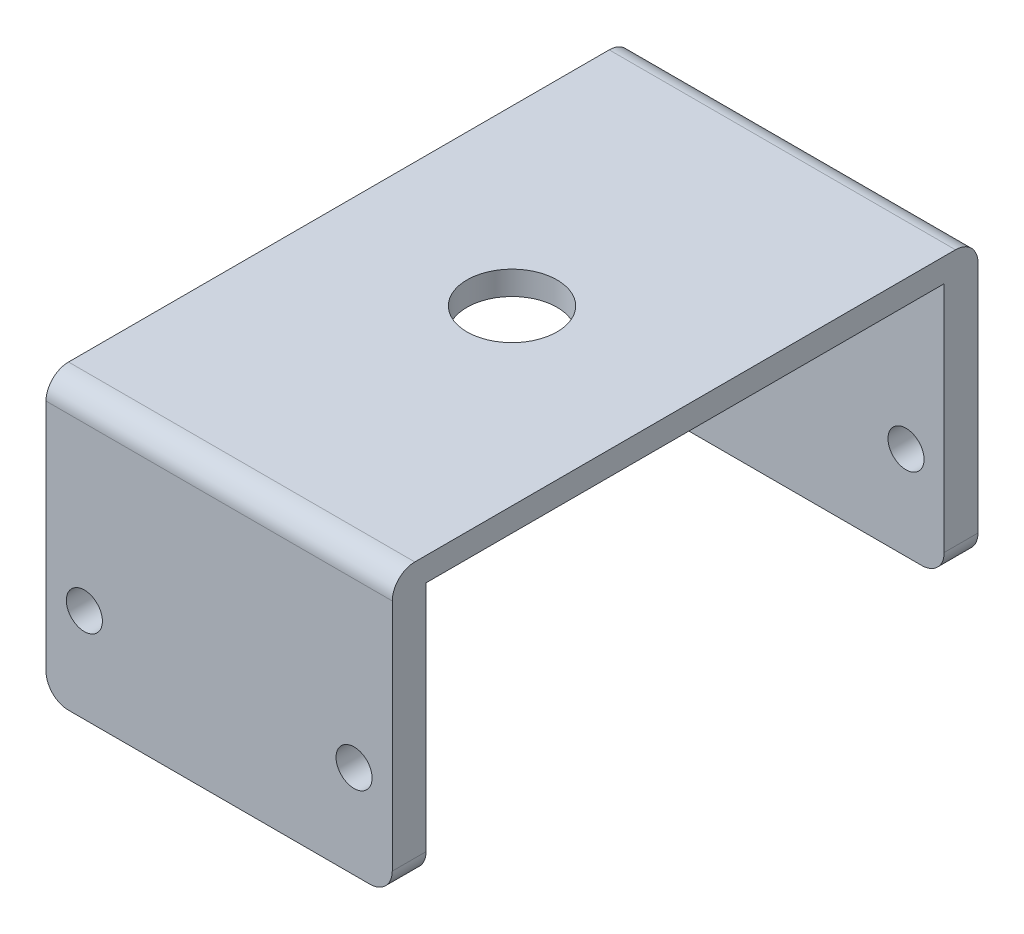
ISO-10303-21;
HEADER;
FILE_DESCRIPTION(('STEP AP214'),'2;1');
FILE_NAME('part.step','',(''),(''),'','','');
FILE_SCHEMA(('AUTOMOTIVE_DESIGN { 1 0 10303 214 1 1 1 1 }'));
ENDSEC;
DATA;
#1=APPLICATION_CONTEXT('core data for automotive mechanical design processes');
#2=APPLICATION_PROTOCOL_DEFINITION('international standard','automotive_design',2000,#1);
#3=PRODUCT_CONTEXT('',#1,'mechanical');
#4=PRODUCT('Part','Part','',(#3));
#5=PRODUCT_RELATED_PRODUCT_CATEGORY('part','',(#4));
#6=PRODUCT_DEFINITION_FORMATION('','',#4);
#7=PRODUCT_DEFINITION_CONTEXT('part definition',#1,'design');
#8=PRODUCT_DEFINITION('design','',#6,#7);
#9=PRODUCT_DEFINITION_SHAPE('','',#8);
#10=(LENGTH_UNIT() NAMED_UNIT(*) SI_UNIT(.MILLI.,.METRE.));
#11=(NAMED_UNIT(*) PLANE_ANGLE_UNIT() SI_UNIT($,.RADIAN.));
#12=(NAMED_UNIT(*) SI_UNIT($,.STERADIAN.) SOLID_ANGLE_UNIT());
#13=UNCERTAINTY_MEASURE_WITH_UNIT(LENGTH_MEASURE(1.E-05),#10,'distance_accuracy_value','');
#14=(GEOMETRIC_REPRESENTATION_CONTEXT(3) GLOBAL_UNCERTAINTY_ASSIGNED_CONTEXT((#13)) GLOBAL_UNIT_ASSIGNED_CONTEXT((#10,
#11,#12)) REPRESENTATION_CONTEXT('',''));
#15=CARTESIAN_POINT('',(0.,0.,0.));
#16=DIRECTION('',(0.,0.,1.));
#17=DIRECTION('',(1.,0.,0.));
#18=AXIS2_PLACEMENT_3D('',#15,#16,#17);
#19=CARTESIAN_POINT('',(28.6490619392168,74.1207320545637,-2.));
#20=DIRECTION('',(-1.,0.,0.));
#21=DIRECTION('',(0.,0.,1.));
#22=AXIS2_PLACEMENT_3D('',#19,#20,#21);
#23=PLANE('',#22);
#24=DIRECTION('',(0.,-1.,0.));
#25=VECTOR('',#24,1.);
#26=CARTESIAN_POINT('',(28.6490619392168,74.1207320545637,47.));
#27=LINE('',#26,#25);
#28=CARTESIAN_POINT('',(28.6490619392168,72.0132027112234,47.));
#29=VERTEX_POINT('',#28);
#30=CARTESIAN_POINT('',(28.6490619392168,51.3468369760944,47.));
#31=VERTEX_POINT('',#30);
#32=EDGE_CURVE('E187',#29,#31,#27,.T.);
#33=ORIENTED_EDGE('',*,*,#32,.T.);
#34=DIRECTION('',(0.,0.,1.));
#35=VECTOR('',#34,1.);
#36=CARTESIAN_POINT('',(28.6490619392168,51.3468369760944,-2.));
#37=LINE('',#36,#35);
#38=CARTESIAN_POINT('',(28.6490619392168,51.3468369760944,50.));
#39=VERTEX_POINT('',#38);
#40=EDGE_CURVE('E240',#31,#39,#37,.T.);
#41=ORIENTED_EDGE('',*,*,#40,.T.);
#42=DIRECTION('',(0.,-1.,0.));
#43=VECTOR('',#42,1.);
#44=CARTESIAN_POINT('',(28.6490619392168,74.1207320545637,50.));
#45=LINE('',#44,#43);
#46=CARTESIAN_POINT('',(28.6490619392168,72.1207320545637,50.));
#47=VERTEX_POINT('',#46);
#48=EDGE_CURVE('E197',#47,#39,#45,.T.);
#49=ORIENTED_EDGE('',*,*,#48,.F.);
#50=CARTESIAN_POINT('',(28.6490619392168,72.1207320545637,48.));
#51=DIRECTION('',(-1.,0.,0.));
#52=DIRECTION('',(0.,0.,1.));
#53=AXIS2_PLACEMENT_3D('',#50,#51,#52);
#54=CIRCLE('',#53,2.);
#55=CARTESIAN_POINT('',(28.6490619392168,74.1207320545637,48.));
#56=VERTEX_POINT('',#55);
#57=EDGE_CURVE('E235',#47,#56,#54,.T.);
#58=ORIENTED_EDGE('',*,*,#57,.T.);
#59=DIRECTION('',(0.,0.,1.));
#60=VECTOR('',#59,1.);
#61=CARTESIAN_POINT('',(28.6490619392168,74.1207320545637,-2.));
#62=LINE('',#61,#60);
#63=CARTESIAN_POINT('',(28.6490619392168,74.1207320545637,0.));
#64=VERTEX_POINT('',#63);
#65=EDGE_CURVE('E221',#64,#56,#62,.T.);
#66=ORIENTED_EDGE('',*,*,#65,.F.);
#67=CARTESIAN_POINT('',(28.6490619392168,72.1207320545637,0.));
#68=DIRECTION('',(-1.,0.,0.));
#69=DIRECTION('',(0.,0.,1.));
#70=AXIS2_PLACEMENT_3D('',#67,#68,#69);
#71=CIRCLE('',#70,2.);
#72=CARTESIAN_POINT('',(28.6490619392168,72.1207320545637,-2.));
#73=VERTEX_POINT('',#72);
#74=EDGE_CURVE('E224',#64,#73,#71,.T.);
#75=ORIENTED_EDGE('',*,*,#74,.T.);
#76=DIRECTION('',(0.,-1.,0.));
#77=VECTOR('',#76,1.);
#78=CARTESIAN_POINT('',(28.6490619392168,74.1207320545637,-2.));
#79=LINE('',#78,#77);
#80=CARTESIAN_POINT('',(28.6490619392168,51.3468369760944,-2.));
#81=VERTEX_POINT('',#80);
#82=EDGE_CURVE('E212',#73,#81,#79,.T.);
#83=ORIENTED_EDGE('',*,*,#82,.T.);
#84=DIRECTION('',(0.,0.,1.));
#85=VECTOR('',#84,1.);
#86=CARTESIAN_POINT('',(28.6490619392168,51.3468369760944,-2.));
#87=LINE('',#86,#85);
#88=CARTESIAN_POINT('',(28.6490619392168,51.3468369760944,1.));
#89=VERTEX_POINT('',#88);
#90=EDGE_CURVE('E237',#81,#89,#87,.T.);
#91=ORIENTED_EDGE('',*,*,#90,.T.);
#92=DIRECTION('',(0.,-1.,0.));
#93=VECTOR('',#92,1.);
#94=CARTESIAN_POINT('',(28.6490619392168,74.1207320545637,1.));
#95=LINE('',#94,#93);
#96=CARTESIAN_POINT('',(28.6490619392168,72.0132027112234,1.));
#97=VERTEX_POINT('',#96);
#98=EDGE_CURVE('E181',#97,#89,#95,.T.);
#99=ORIENTED_EDGE('',*,*,#98,.F.);
#100=DIRECTION('',(0.,0.,-1.));
#101=VECTOR('',#100,1.);
#102=CARTESIAN_POINT('',(28.6490619392168,72.0132027112234,-2.));
#103=LINE('',#102,#101);
#104=EDGE_CURVE('E159',#29,#97,#103,.T.);
#105=ORIENTED_EDGE('',*,*,#104,.F.);
#106=EDGE_LOOP('',(#33,#41,#49,#58,#66,#75,#83,#91,#99,#105));
#107=FACE_BOUND('',#106,.T.);
#108=ADVANCED_FACE('F37',(#107),#23,.T.);
#109=CARTESIAN_POINT('',(59.3900912143275,74.1207320545637,-2.));
#110=DIRECTION('',(1.,0.,0.));
#111=DIRECTION('',(0.,0.,-1.));
#112=AXIS2_PLACEMENT_3D('',#109,#110,#111);
#113=PLANE('',#112);
#114=DIRECTION('',(0.,1.,0.));
#115=VECTOR('',#114,1.);
#116=CARTESIAN_POINT('',(59.3900912143275,74.1207320545637,50.));
#117=LINE('',#116,#115);
#118=CARTESIAN_POINT('',(59.3900912143275,51.3468369760944,50.));
#119=VERTEX_POINT('',#118);
#120=CARTESIAN_POINT('',(59.3900912143275,72.1207320545637,50.));
#121=VERTEX_POINT('',#120);
#122=EDGE_CURVE('E203',#119,#121,#117,.T.);
#123=ORIENTED_EDGE('',*,*,#122,.F.);
#124=DIRECTION('',(0.,0.,1.));
#125=VECTOR('',#124,1.);
#126=CARTESIAN_POINT('',(59.3900912143275,51.3468369760944,-2.));
#127=LINE('',#126,#125);
#128=CARTESIAN_POINT('',(59.3900912143275,51.3468369760944,47.));
#129=VERTEX_POINT('',#128);
#130=EDGE_CURVE('E265',#119,#129,#127,.F.);
#131=ORIENTED_EDGE('',*,*,#130,.T.);
#132=DIRECTION('',(0.,1.,0.));
#133=VECTOR('',#132,1.);
#134=CARTESIAN_POINT('',(59.3900912143275,0.,47.));
#135=LINE('',#134,#133);
#136=CARTESIAN_POINT('',(59.3900912143275,72.0132027112234,47.));
#137=VERTEX_POINT('',#136);
#138=EDGE_CURVE('E166',#129,#137,#135,.T.);
#139=ORIENTED_EDGE('',*,*,#138,.T.);
#140=DIRECTION('',(0.,0.,1.));
#141=VECTOR('',#140,1.);
#142=CARTESIAN_POINT('',(59.3900912143275,72.0132027112234,0.));
#143=LINE('',#142,#141);
#144=CARTESIAN_POINT('',(59.3900912143275,72.0132027112234,1.));
#145=VERTEX_POINT('',#144);
#146=EDGE_CURVE('E151',#145,#137,#143,.T.);
#147=ORIENTED_EDGE('',*,*,#146,.F.);
#148=DIRECTION('',(0.,1.,0.));
#149=VECTOR('',#148,1.);
#150=CARTESIAN_POINT('',(59.3900912143275,0.,1.));
#151=LINE('',#150,#149);
#152=CARTESIAN_POINT('',(59.3900912143275,51.3468369760944,1.));
#153=VERTEX_POINT('',#152);
#154=EDGE_CURVE('E139',#153,#145,#151,.T.);
#155=ORIENTED_EDGE('',*,*,#154,.F.);
#156=DIRECTION('',(0.,0.,1.));
#157=VECTOR('',#156,1.);
#158=CARTESIAN_POINT('',(59.3900912143275,51.3468369760944,-2.));
#159=LINE('',#158,#157);
#160=CARTESIAN_POINT('',(59.3900912143275,51.3468369760944,-2.));
#161=VERTEX_POINT('',#160);
#162=EDGE_CURVE('E263',#153,#161,#159,.F.);
#163=ORIENTED_EDGE('',*,*,#162,.T.);
#164=DIRECTION('',(0.,1.,0.));
#165=VECTOR('',#164,1.);
#166=CARTESIAN_POINT('',(59.3900912143275,74.1207320545637,-2.));
#167=LINE('',#166,#165);
#168=CARTESIAN_POINT('',(59.3900912143275,72.1207320545637,-2.));
#169=VERTEX_POINT('',#168);
#170=EDGE_CURVE('E217',#161,#169,#167,.T.);
#171=ORIENTED_EDGE('',*,*,#170,.T.);
#172=CARTESIAN_POINT('',(59.3900912143275,72.1207320545637,0.));
#173=DIRECTION('',(1.,0.,0.));
#174=DIRECTION('',(0.,0.,-1.));
#175=AXIS2_PLACEMENT_3D('',#172,#173,#174);
#176=CIRCLE('',#175,2.);
#177=CARTESIAN_POINT('',(59.3900912143275,74.1207320545637,0.));
#178=VERTEX_POINT('',#177);
#179=EDGE_CURVE('E259',#169,#178,#176,.T.);
#180=ORIENTED_EDGE('',*,*,#179,.T.);
#181=DIRECTION('',(0.,0.,1.));
#182=VECTOR('',#181,1.);
#183=CARTESIAN_POINT('',(59.3900912143275,74.1207320545637,-2.));
#184=LINE('',#183,#182);
#185=CARTESIAN_POINT('',(59.3900912143275,74.1207320545637,48.));
#186=VERTEX_POINT('',#185);
#187=EDGE_CURVE('E220',#178,#186,#184,.T.);
#188=ORIENTED_EDGE('',*,*,#187,.T.);
#189=CARTESIAN_POINT('',(59.3900912143275,72.1207320545637,48.));
#190=DIRECTION('',(1.,0.,0.));
#191=DIRECTION('',(0.,0.,-1.));
#192=AXIS2_PLACEMENT_3D('',#189,#190,#191);
#193=CIRCLE('',#192,2.);
#194=EDGE_CURVE('E261',#186,#121,#193,.T.);
#195=ORIENTED_EDGE('',*,*,#194,.T.);
#196=EDGE_LOOP('',(#123,#131,#139,#147,#155,#163,#171,#180,#188,#195));
#197=FACE_BOUND('',#196,.T.);
#198=ADVANCED_FACE('F164',(#197),#113,.T.);
#199=CARTESIAN_POINT('',(28.6490619392168,49.3468369760944,-2.));
#200=DIRECTION('',(0.,-1.,0.));
#201=DIRECTION('',(0.,0.,-1.));
#202=AXIS2_PLACEMENT_3D('',#199,#200,#201);
#203=PLANE('',#202);
#204=DIRECTION('',(1.,0.,0.));
#205=VECTOR('',#204,1.);
#206=CARTESIAN_POINT('',(28.6490619392168,49.3468369760944,50.));
#207=LINE('',#206,#205);
#208=CARTESIAN_POINT('',(30.6490619392168,49.3468369760944,50.));
#209=VERTEX_POINT('',#208);
#210=CARTESIAN_POINT('',(57.3900912143275,49.3468369760944,50.));
#211=VERTEX_POINT('',#210);
#212=EDGE_CURVE('E200',#209,#211,#207,.T.);
#213=ORIENTED_EDGE('',*,*,#212,.F.);
#214=DIRECTION('',(0.,0.,1.));
#215=VECTOR('',#214,1.);
#216=CARTESIAN_POINT('',(30.6490619392168,49.3468369760944,-2.));
#217=LINE('',#216,#215);
#218=CARTESIAN_POINT('',(30.6490619392168,49.3468369760944,47.));
#219=VERTEX_POINT('',#218);
#220=EDGE_CURVE('E253',#209,#219,#217,.F.);
#221=ORIENTED_EDGE('',*,*,#220,.T.);
#222=DIRECTION('',(1.,0.,0.));
#223=VECTOR('',#222,1.);
#224=CARTESIAN_POINT('',(9.3900912143275,49.3468369760944,47.));
#225=LINE('',#224,#223);
#226=CARTESIAN_POINT('',(57.3900912143275,49.3468369760944,47.));
#227=VERTEX_POINT('',#226);
#228=EDGE_CURVE('E172',#219,#227,#225,.T.);
#229=ORIENTED_EDGE('',*,*,#228,.T.);
#230=DIRECTION('',(0.,0.,1.));
#231=VECTOR('',#230,1.);
#232=CARTESIAN_POINT('',(57.3900912143275,49.3468369760944,-2.));
#233=LINE('',#232,#231);
#234=EDGE_CURVE('E250',#227,#211,#233,.T.);
#235=ORIENTED_EDGE('',*,*,#234,.T.);
#236=EDGE_LOOP('',(#213,#221,#229,#235));
#237=FACE_BOUND('',#236,.T.);
#238=ADVANCED_FACE('F309',(#237),#203,.T.);
#239=CARTESIAN_POINT('',(55.9991217398444,57.6069527072445,76.));
#240=DIRECTION('',(0.,0.,-1.));
#241=DIRECTION('',(-1.,0.,0.));
#242=AXIS2_PLACEMENT_3D('',#239,#240,#241);
#243=CYLINDRICAL_SURFACE('',#242,1.59999999999986);
#244=CARTESIAN_POINT('',(55.9991217398444,57.6069527072445,50.));
#245=DIRECTION('',(0.,0.,1.));
#246=DIRECTION('',(1.,0.,0.));
#247=AXIS2_PLACEMENT_3D('',#244,#245,#246);
#248=CIRCLE('',#247,1.59999999999986);
#249=CARTESIAN_POINT('',(57.5991217398443,57.6069527072445,50.));
#250=VERTEX_POINT('',#249);
#251=EDGE_CURVE('E191',#250,#250,#248,.T.);
#252=ORIENTED_EDGE('',*,*,#251,.T.);
#253=EDGE_LOOP('',(#252));
#254=FACE_BOUND('',#253,.T.);
#255=CARTESIAN_POINT('',(55.9991217398444,57.6069527072445,47.));
#256=DIRECTION('',(0.,0.,-1.));
#257=DIRECTION('',(-1.,0.,0.));
#258=AXIS2_PLACEMENT_3D('',#255,#256,#257);
#259=CIRCLE('',#258,1.59999999999986);
#260=CARTESIAN_POINT('',(54.3991217398445,57.6069527072445,47.));
#261=VERTEX_POINT('',#260);
#262=EDGE_CURVE('E184',#261,#261,#259,.F.);
#263=ORIENTED_EDGE('',*,*,#262,.F.);
#264=EDGE_LOOP('',(#263));
#265=FACE_BOUND('',#264,.T.);
#266=ADVANCED_FACE('F346',(#254,#265),#243,.F.);
#267=CARTESIAN_POINT('',(32.0547120458447,57.694813477697,76.));
#268=DIRECTION('',(0.,0.,-1.));
#269=DIRECTION('',(-1.,0.,0.));
#270=AXIS2_PLACEMENT_3D('',#267,#268,#269);
#271=CYLINDRICAL_SURFACE('',#270,1.59999999999993);
#272=CARTESIAN_POINT('',(32.0547120458447,57.694813477697,50.));
#273=DIRECTION('',(0.,0.,1.));
#274=DIRECTION('',(1.,0.,0.));
#275=AXIS2_PLACEMENT_3D('',#272,#273,#274);
#276=CIRCLE('',#275,1.59999999999993);
#277=CARTESIAN_POINT('',(33.6547120458447,57.694813477697,50.));
#278=VERTEX_POINT('',#277);
#279=EDGE_CURVE('E194',#278,#278,#276,.T.);
#280=ORIENTED_EDGE('',*,*,#279,.T.);
#281=EDGE_LOOP('',(#280));
#282=FACE_BOUND('',#281,.T.);
#283=CARTESIAN_POINT('',(32.0547120458447,57.694813477697,47.));
#284=DIRECTION('',(0.,0.,-1.));
#285=DIRECTION('',(-1.,0.,0.));
#286=AXIS2_PLACEMENT_3D('',#283,#284,#285);
#287=CIRCLE('',#286,1.59999999999993);
#288=CARTESIAN_POINT('',(30.4547120458448,57.694813477697,47.));
#289=VERTEX_POINT('',#288);
#290=EDGE_CURVE('E183',#289,#289,#287,.F.);
#291=ORIENTED_EDGE('',*,*,#290,.F.);
#292=EDGE_LOOP('',(#291));
#293=FACE_BOUND('',#292,.T.);
#294=ADVANCED_FACE('F342',(#282,#293),#271,.F.);
#295=CARTESIAN_POINT('',(28.6490619392168,74.1207320545637,-2.));
#296=DIRECTION('',(0.,1.,0.));
#297=DIRECTION('',(0.,0.,1.));
#298=AXIS2_PLACEMENT_3D('',#295,#296,#297);
#299=PLANE('',#298);
#300=CARTESIAN_POINT('',(44.0195765767722,74.1207320545637,24.));
#301=DIRECTION('',(0.,1.,0.));
#302=DIRECTION('',(0.,0.,1.));
#303=AXIS2_PLACEMENT_3D('',#300,#301,#302);
#304=CIRCLE('',#303,4.00000000000001);
#305=CARTESIAN_POINT('',(44.0195765767722,74.1207320545637,28.));
#306=VERTEX_POINT('',#305);
#307=EDGE_CURVE('E152',#306,#306,#304,.F.);
#308=ORIENTED_EDGE('',*,*,#307,.T.);
#309=EDGE_LOOP('',(#308));
#310=FACE_BOUND('',#309,.T.);
#311=ORIENTED_EDGE('',*,*,#65,.T.);
#312=DIRECTION('',(-1.,0.,0.));
#313=VECTOR('',#312,1.);
#314=CARTESIAN_POINT('',(28.6490619392168,74.1207320545637,48.));
#315=LINE('',#314,#313);
#316=EDGE_CURVE('E11',#56,#186,#315,.F.);
#317=ORIENTED_EDGE('',*,*,#316,.T.);
#318=ORIENTED_EDGE('',*,*,#187,.F.);
#319=DIRECTION('',(-1.,0.,0.));
#320=VECTOR('',#319,1.);
#321=CARTESIAN_POINT('',(28.6490619392168,74.1207320545637,0.));
#322=LINE('',#321,#320);
#323=EDGE_CURVE('E45',#178,#64,#322,.T.);
#324=ORIENTED_EDGE('',*,*,#323,.T.);
#325=EDGE_LOOP('',(#311,#317,#318,#324));
#326=FACE_BOUND('',#325,.T.);
#327=ADVANCED_FACE('F283',(#310,#326),#299,.T.);
#328=DIRECTION('',(1.,0.,0.));
#329=VECTOR('',#328,1.);
#330=CARTESIAN_POINT('',(28.6490619392168,49.3468369760944,-2.));
#331=LINE('',#330,#329);
#332=CARTESIAN_POINT('',(30.6490619392168,49.3468369760944,-2.));
#333=VERTEX_POINT('',#332);
#334=CARTESIAN_POINT('',(57.3900912143275,49.3468369760944,-2.));
#335=VERTEX_POINT('',#334);
#336=EDGE_CURVE('E215',#333,#335,#331,.T.);
#337=ORIENTED_EDGE('',*,*,#336,.T.);
#338=DIRECTION('',(0.,0.,1.));
#339=VECTOR('',#338,1.);
#340=CARTESIAN_POINT('',(57.3900912143275,49.3468369760944,-2.));
#341=LINE('',#340,#339);
#342=CARTESIAN_POINT('',(57.3900912143275,49.3468369760944,1.));
#343=VERTEX_POINT('',#342);
#344=EDGE_CURVE('E268',#335,#343,#341,.T.);
#345=ORIENTED_EDGE('',*,*,#344,.T.);
#346=DIRECTION('',(1.,0.,0.));
#347=VECTOR('',#346,1.);
#348=CARTESIAN_POINT('',(9.3900912143275,49.3468369760944,1.));
#349=LINE('',#348,#347);
#350=CARTESIAN_POINT('',(30.6490619392168,49.3468369760944,1.));
#351=VERTEX_POINT('',#350);
#352=EDGE_CURVE('E161',#351,#343,#349,.T.);
#353=ORIENTED_EDGE('',*,*,#352,.F.);
#354=DIRECTION('',(0.,0.,1.));
#355=VECTOR('',#354,1.);
#356=CARTESIAN_POINT('',(30.6490619392168,49.3468369760944,-2.));
#357=LINE('',#356,#355);
#358=EDGE_CURVE('E59',#351,#333,#357,.F.);
#359=ORIENTED_EDGE('',*,*,#358,.T.);
#360=EDGE_LOOP('',(#337,#345,#353,#359));
#361=FACE_BOUND('',#360,.T.);
#362=ADVANCED_FACE('F316',(#361),#203,.T.);
#363=CARTESIAN_POINT('',(0.,0.,-2.));
#364=DIRECTION('',(0.,0.,1.));
#365=DIRECTION('',(1.,0.,0.));
#366=AXIS2_PLACEMENT_3D('',#363,#364,#365);
#367=PLANE('',#366);
#368=CARTESIAN_POINT('',(55.9991217398444,57.6069527072445,-2.));
#369=DIRECTION('',(0.,0.,1.));
#370=DIRECTION('',(1.,0.,0.));
#371=AXIS2_PLACEMENT_3D('',#368,#369,#370);
#372=CIRCLE('',#371,1.59999999999986);
#373=CARTESIAN_POINT('',(57.5991217398443,57.6069527072445,-2.));
#374=VERTEX_POINT('',#373);
#375=EDGE_CURVE('E206',#374,#374,#372,.T.);
#376=ORIENTED_EDGE('',*,*,#375,.T.);
#377=EDGE_LOOP('',(#376));
#378=FACE_BOUND('',#377,.T.);
#379=CARTESIAN_POINT('',(32.0547120458447,57.694813477697,-2.));
#380=DIRECTION('',(0.,0.,1.));
#381=DIRECTION('',(1.,0.,0.));
#382=AXIS2_PLACEMENT_3D('',#379,#380,#381);
#383=CIRCLE('',#382,1.59999999999993);
#384=CARTESIAN_POINT('',(33.6547120458447,57.694813477697,-2.));
#385=VERTEX_POINT('',#384);
#386=EDGE_CURVE('E209',#385,#385,#383,.T.);
#387=ORIENTED_EDGE('',*,*,#386,.T.);
#388=EDGE_LOOP('',(#387));
#389=FACE_BOUND('',#388,.T.);
#390=ORIENTED_EDGE('',*,*,#170,.F.);
#391=CARTESIAN_POINT('',(57.3900912143275,51.3468369760944,-2.));
#392=DIRECTION('',(0.,0.,1.));
#393=DIRECTION('',(1.,0.,0.));
#394=AXIS2_PLACEMENT_3D('',#391,#392,#393);
#395=CIRCLE('',#394,2.);
#396=EDGE_CURVE('E52',#161,#335,#395,.F.);
#397=ORIENTED_EDGE('',*,*,#396,.T.);
#398=ORIENTED_EDGE('',*,*,#336,.F.);
#399=CARTESIAN_POINT('',(30.6490619392168,51.3468369760944,-2.));
#400=DIRECTION('',(0.,0.,1.));
#401=DIRECTION('',(1.,0.,0.));
#402=AXIS2_PLACEMENT_3D('',#399,#400,#401);
#403=CIRCLE('',#402,2.);
#404=EDGE_CURVE('E276',#333,#81,#403,.F.);
#405=ORIENTED_EDGE('',*,*,#404,.T.);
#406=ORIENTED_EDGE('',*,*,#82,.F.);
#407=DIRECTION('',(-1.,0.,0.));
#408=VECTOR('',#407,1.);
#409=CARTESIAN_POINT('',(59.3900912143275,72.1207320545637,-2.));
#410=LINE('',#409,#408);
#411=EDGE_CURVE('E274',#73,#169,#410,.F.);
#412=ORIENTED_EDGE('',*,*,#411,.T.);
#413=EDGE_LOOP('',(#390,#397,#398,#405,#406,#412));
#414=FACE_BOUND('',#413,.T.);
#415=ADVANCED_FACE('F320',(#378,#389,#414),#367,.F.);
#416=CARTESIAN_POINT('',(0.,0.,50.));
#417=DIRECTION('',(0.,0.,1.));
#418=DIRECTION('',(1.,0.,0.));
#419=AXIS2_PLACEMENT_3D('',#416,#417,#418);
#420=PLANE('',#419);
#421=ORIENTED_EDGE('',*,*,#279,.F.);
#422=EDGE_LOOP('',(#421));
#423=FACE_BOUND('',#422,.T.);
#424=ORIENTED_EDGE('',*,*,#48,.T.);
#425=CARTESIAN_POINT('',(30.6490619392168,51.3468369760944,50.));
#426=DIRECTION('',(0.,0.,1.));
#427=DIRECTION('',(1.,0.,0.));
#428=AXIS2_PLACEMENT_3D('',#425,#426,#427);
#429=CIRCLE('',#428,2.);
#430=EDGE_CURVE('E248',#39,#209,#429,.T.);
#431=ORIENTED_EDGE('',*,*,#430,.T.);
#432=ORIENTED_EDGE('',*,*,#212,.T.);
#433=CARTESIAN_POINT('',(57.3900912143275,51.3468369760944,50.));
#434=DIRECTION('',(0.,0.,1.));
#435=DIRECTION('',(1.,0.,0.));
#436=AXIS2_PLACEMENT_3D('',#433,#434,#435);
#437=CIRCLE('',#436,2.);
#438=EDGE_CURVE('E246',#211,#119,#437,.T.);
#439=ORIENTED_EDGE('',*,*,#438,.T.);
#440=ORIENTED_EDGE('',*,*,#122,.T.);
#441=DIRECTION('',(-1.,0.,0.));
#442=VECTOR('',#441,1.);
#443=CARTESIAN_POINT('',(0.,72.1207320545637,50.));
#444=LINE('',#443,#442);
#445=EDGE_CURVE('E243',#121,#47,#444,.T.);
#446=ORIENTED_EDGE('',*,*,#445,.T.);
#447=EDGE_LOOP('',(#424,#431,#432,#439,#440,#446));
#448=FACE_BOUND('',#447,.T.);
#449=ORIENTED_EDGE('',*,*,#251,.F.);
#450=EDGE_LOOP('',(#449));
#451=FACE_BOUND('',#450,.T.);
#452=ADVANCED_FACE('F295',(#423,#448,#451),#420,.T.);
#453=CARTESIAN_POINT('',(55.9991217398444,57.6069527072445,1.));
#454=DIRECTION('',(0.,0.,-1.));
#455=DIRECTION('',(-1.,0.,0.));
#456=AXIS2_PLACEMENT_3D('',#453,#454,#455);
#457=CIRCLE('',#456,1.59999999999986);
#458=CARTESIAN_POINT('',(54.3991217398445,57.6069527072445,1.));
#459=VERTEX_POINT('',#458);
#460=EDGE_CURVE('E178',#459,#459,#457,.F.);
#461=ORIENTED_EDGE('',*,*,#460,.T.);
#462=EDGE_LOOP('',(#461));
#463=FACE_BOUND('',#462,.T.);
#464=ORIENTED_EDGE('',*,*,#375,.F.);
#465=EDGE_LOOP('',(#464));
#466=FACE_BOUND('',#465,.T.);
#467=ADVANCED_FACE('F340',(#463,#466),#243,.F.);
#468=CARTESIAN_POINT('',(32.0547120458447,57.694813477697,1.));
#469=DIRECTION('',(0.,0.,-1.));
#470=DIRECTION('',(-1.,0.,0.));
#471=AXIS2_PLACEMENT_3D('',#468,#469,#470);
#472=CIRCLE('',#471,1.59999999999993);
#473=CARTESIAN_POINT('',(30.4547120458448,57.694813477697,1.));
#474=VERTEX_POINT('',#473);
#475=EDGE_CURVE('E175',#474,#474,#472,.F.);
#476=ORIENTED_EDGE('',*,*,#475,.T.);
#477=EDGE_LOOP('',(#476));
#478=FACE_BOUND('',#477,.T.);
#479=ORIENTED_EDGE('',*,*,#386,.F.);
#480=EDGE_LOOP('',(#479));
#481=FACE_BOUND('',#480,.T.);
#482=ADVANCED_FACE('F337',(#478,#481),#271,.F.);
#483=CARTESIAN_POINT('',(9.3900912143275,0.,47.));
#484=DIRECTION('',(0.,0.,-1.));
#485=DIRECTION('',(-1.,0.,0.));
#486=AXIS2_PLACEMENT_3D('',#483,#484,#485);
#487=PLANE('',#486);
#488=ORIENTED_EDGE('',*,*,#228,.F.);
#489=CARTESIAN_POINT('',(30.6490619392168,51.3468369760944,47.));
#490=DIRECTION('',(0.,0.,-1.));
#491=DIRECTION('',(-1.,0.,0.));
#492=AXIS2_PLACEMENT_3D('',#489,#490,#491);
#493=CIRCLE('',#492,2.);
#494=EDGE_CURVE('E257',#219,#31,#493,.T.);
#495=ORIENTED_EDGE('',*,*,#494,.T.);
#496=ORIENTED_EDGE('',*,*,#32,.F.);
#497=DIRECTION('',(1.,0.,0.));
#498=VECTOR('',#497,1.);
#499=CARTESIAN_POINT('',(9.3900912143275,72.0132027112234,47.));
#500=LINE('',#499,#498);
#501=EDGE_CURVE('E160',#29,#137,#500,.T.);
#502=ORIENTED_EDGE('',*,*,#501,.T.);
#503=ORIENTED_EDGE('',*,*,#138,.F.);
#504=CARTESIAN_POINT('',(57.3900912143275,51.3468369760944,47.));
#505=DIRECTION('',(0.,0.,-1.));
#506=DIRECTION('',(-1.,0.,0.));
#507=AXIS2_PLACEMENT_3D('',#504,#505,#506);
#508=CIRCLE('',#507,2.);
#509=EDGE_CURVE('E255',#129,#227,#508,.T.);
#510=ORIENTED_EDGE('',*,*,#509,.T.);
#511=EDGE_LOOP('',(#488,#495,#496,#502,#503,#510));
#512=FACE_BOUND('',#511,.T.);
#513=ORIENTED_EDGE('',*,*,#290,.T.);
#514=EDGE_LOOP('',(#513));
#515=FACE_BOUND('',#514,.T.);
#516=ORIENTED_EDGE('',*,*,#262,.T.);
#517=EDGE_LOOP('',(#516));
#518=FACE_BOUND('',#517,.T.);
#519=ADVANCED_FACE('F304',(#512,#515,#518),#487,.T.);
#520=CARTESIAN_POINT('',(9.3900912143275,0.,1.));
#521=DIRECTION('',(0.,0.,-1.));
#522=DIRECTION('',(-1.,0.,0.));
#523=AXIS2_PLACEMENT_3D('',#520,#521,#522);
#524=PLANE('',#523);
#525=ORIENTED_EDGE('',*,*,#352,.T.);
#526=CARTESIAN_POINT('',(57.3900912143275,51.3468369760944,1.));
#527=DIRECTION('',(0.,0.,-1.));
#528=DIRECTION('',(-1.,0.,0.));
#529=AXIS2_PLACEMENT_3D('',#526,#527,#528);
#530=CIRCLE('',#529,2.);
#531=EDGE_CURVE('E147',#343,#153,#530,.F.);
#532=ORIENTED_EDGE('',*,*,#531,.T.);
#533=ORIENTED_EDGE('',*,*,#154,.T.);
#534=DIRECTION('',(1.,0.,0.));
#535=VECTOR('',#534,1.);
#536=CARTESIAN_POINT('',(9.3900912143275,72.0132027112234,1.));
#537=LINE('',#536,#535);
#538=EDGE_CURVE('E145',#97,#145,#537,.T.);
#539=ORIENTED_EDGE('',*,*,#538,.F.);
#540=ORIENTED_EDGE('',*,*,#98,.T.);
#541=CARTESIAN_POINT('',(30.6490619392168,51.3468369760944,1.));
#542=DIRECTION('',(0.,0.,-1.));
#543=DIRECTION('',(-1.,0.,0.));
#544=AXIS2_PLACEMENT_3D('',#541,#542,#543);
#545=CIRCLE('',#544,2.);
#546=EDGE_CURVE('E271',#89,#351,#545,.F.);
#547=ORIENTED_EDGE('',*,*,#546,.T.);
#548=EDGE_LOOP('',(#525,#532,#533,#539,#540,#547));
#549=FACE_BOUND('',#548,.T.);
#550=ORIENTED_EDGE('',*,*,#475,.F.);
#551=EDGE_LOOP('',(#550));
#552=FACE_BOUND('',#551,.T.);
#553=ORIENTED_EDGE('',*,*,#460,.F.);
#554=EDGE_LOOP('',(#553));
#555=FACE_BOUND('',#554,.T.);
#556=ADVANCED_FACE('F142',(#549,#552,#555),#524,.F.);
#557=CARTESIAN_POINT('',(9.3900912143275,72.0132027112234,0.));
#558=DIRECTION('',(0.,1.,0.));
#559=DIRECTION('',(0.,0.,1.));
#560=AXIS2_PLACEMENT_3D('',#557,#558,#559);
#561=PLANE('',#560);
#562=CARTESIAN_POINT('',(44.0195765767722,72.0132027112234,24.));
#563=DIRECTION('',(0.,1.,0.));
#564=DIRECTION('',(0.,0.,1.));
#565=AXIS2_PLACEMENT_3D('',#562,#563,#564);
#566=CIRCLE('',#565,4.00000000000001);
#567=CARTESIAN_POINT('',(44.0195765767722,72.0132027112234,28.));
#568=VERTEX_POINT('',#567);
#569=EDGE_CURVE('E231',#568,#568,#566,.F.);
#570=ORIENTED_EDGE('',*,*,#569,.F.);
#571=EDGE_LOOP('',(#570));
#572=FACE_BOUND('',#571,.T.);
#573=ORIENTED_EDGE('',*,*,#104,.T.);
#574=ORIENTED_EDGE('',*,*,#538,.T.);
#575=ORIENTED_EDGE('',*,*,#146,.T.);
#576=ORIENTED_EDGE('',*,*,#501,.F.);
#577=EDGE_LOOP('',(#573,#574,#575,#576));
#578=FACE_BOUND('',#577,.T.);
#579=ADVANCED_FACE('F156',(#572,#578),#561,.F.);
#580=CARTESIAN_POINT('',(44.0195765767722,124.120732054564,24.));
#581=DIRECTION('',(0.,-1.,0.));
#582=DIRECTION('',(0.,0.,-1.));
#583=AXIS2_PLACEMENT_3D('',#580,#581,#582);
#584=CYLINDRICAL_SURFACE('',#583,4.00000000000001);
#585=ORIENTED_EDGE('',*,*,#307,.F.);
#586=EDGE_LOOP('',(#585));
#587=FACE_BOUND('',#586,.T.);
#588=ORIENTED_EDGE('',*,*,#569,.T.);
#589=EDGE_LOOP('',(#588));
#590=FACE_BOUND('',#589,.T.);
#591=ADVANCED_FACE('F349',(#587,#590),#584,.F.);
#592=CARTESIAN_POINT('',(30.6490619392168,51.3468369760944,-2.));
#593=DIRECTION('',(0.,0.,1.));
#594=DIRECTION('',(1.,0.,0.));
#595=AXIS2_PLACEMENT_3D('',#592,#593,#594);
#596=CYLINDRICAL_SURFACE('',#595,2.);
#597=ORIENTED_EDGE('',*,*,#494,.F.);
#598=ORIENTED_EDGE('',*,*,#220,.F.);
#599=ORIENTED_EDGE('',*,*,#430,.F.);
#600=ORIENTED_EDGE('',*,*,#40,.F.);
#601=EDGE_LOOP('',(#597,#598,#599,#600));
#602=FACE_BOUND('',#601,.T.);
#603=ADVANCED_FACE('F312',(#602),#596,.T.);
#604=CARTESIAN_POINT('',(57.3900912143275,51.3468369760944,-2.));
#605=DIRECTION('',(0.,0.,1.));
#606=DIRECTION('',(1.,0.,0.));
#607=AXIS2_PLACEMENT_3D('',#604,#605,#606);
#608=CYLINDRICAL_SURFACE('',#607,2.);
#609=ORIENTED_EDGE('',*,*,#509,.F.);
#610=ORIENTED_EDGE('',*,*,#130,.F.);
#611=ORIENTED_EDGE('',*,*,#438,.F.);
#612=ORIENTED_EDGE('',*,*,#234,.F.);
#613=EDGE_LOOP('',(#609,#610,#611,#612));
#614=FACE_BOUND('',#613,.T.);
#615=ADVANCED_FACE('F300',(#614),#608,.T.);
#616=CARTESIAN_POINT('',(57.3900912143275,51.3468369760944,-2.));
#617=DIRECTION('',(0.,0.,1.));
#618=DIRECTION('',(1.,0.,0.));
#619=AXIS2_PLACEMENT_3D('',#616,#617,#618);
#620=CYLINDRICAL_SURFACE('',#619,2.);
#621=ORIENTED_EDGE('',*,*,#396,.F.);
#622=ORIENTED_EDGE('',*,*,#162,.F.);
#623=ORIENTED_EDGE('',*,*,#531,.F.);
#624=ORIENTED_EDGE('',*,*,#344,.F.);
#625=EDGE_LOOP('',(#621,#622,#623,#624));
#626=FACE_BOUND('',#625,.T.);
#627=ADVANCED_FACE('F323',(#626),#620,.T.);
#628=CARTESIAN_POINT('',(30.6490619392168,51.3468369760944,-2.));
#629=DIRECTION('',(0.,0.,1.));
#630=DIRECTION('',(1.,0.,0.));
#631=AXIS2_PLACEMENT_3D('',#628,#629,#630);
#632=CYLINDRICAL_SURFACE('',#631,2.);
#633=ORIENTED_EDGE('',*,*,#404,.F.);
#634=ORIENTED_EDGE('',*,*,#358,.F.);
#635=ORIENTED_EDGE('',*,*,#546,.F.);
#636=ORIENTED_EDGE('',*,*,#90,.F.);
#637=EDGE_LOOP('',(#633,#634,#635,#636));
#638=FACE_BOUND('',#637,.T.);
#639=ADVANCED_FACE('F319',(#638),#632,.T.);
#640=CARTESIAN_POINT('',(0.,72.1207320545637,48.));
#641=DIRECTION('',(-1.,0.,0.));
#642=DIRECTION('',(0.,0.,1.));
#643=AXIS2_PLACEMENT_3D('',#640,#641,#642);
#644=CYLINDRICAL_SURFACE('',#643,2.);
#645=ORIENTED_EDGE('',*,*,#194,.F.);
#646=ORIENTED_EDGE('',*,*,#316,.F.);
#647=ORIENTED_EDGE('',*,*,#57,.F.);
#648=ORIENTED_EDGE('',*,*,#445,.F.);
#649=EDGE_LOOP('',(#645,#646,#647,#648));
#650=FACE_BOUND('',#649,.T.);
#651=ADVANCED_FACE('F293',(#650),#644,.T.);
#652=CARTESIAN_POINT('',(28.6490619392168,72.1207320545637,0.));
#653=DIRECTION('',(1.,0.,0.));
#654=DIRECTION('',(0.,0.,-1.));
#655=AXIS2_PLACEMENT_3D('',#652,#653,#654);
#656=CYLINDRICAL_SURFACE('',#655,2.);
#657=ORIENTED_EDGE('',*,*,#179,.F.);
#658=ORIENTED_EDGE('',*,*,#411,.F.);
#659=ORIENTED_EDGE('',*,*,#74,.F.);
#660=ORIENTED_EDGE('',*,*,#323,.F.);
#661=EDGE_LOOP('',(#657,#658,#659,#660));
#662=FACE_BOUND('',#661,.T.);
#663=ADVANCED_FACE('F39',(#662),#656,.T.);
#664=CLOSED_SHELL('',(#108,#198,#238,#266,#294,#327,#362,#415,#452,#467,#482,#519,#556,#579,
#591,#603,#615,#627,#639,#651,#663));
#665=MANIFOLD_SOLID_BREP('B2',#664);
#666=ADVANCED_BREP_SHAPE_REPRESENTATION('',(#18,#665),#14);
#667=SHAPE_DEFINITION_REPRESENTATION(#9,#666);
ENDSEC;
END-ISO-10303-21;
